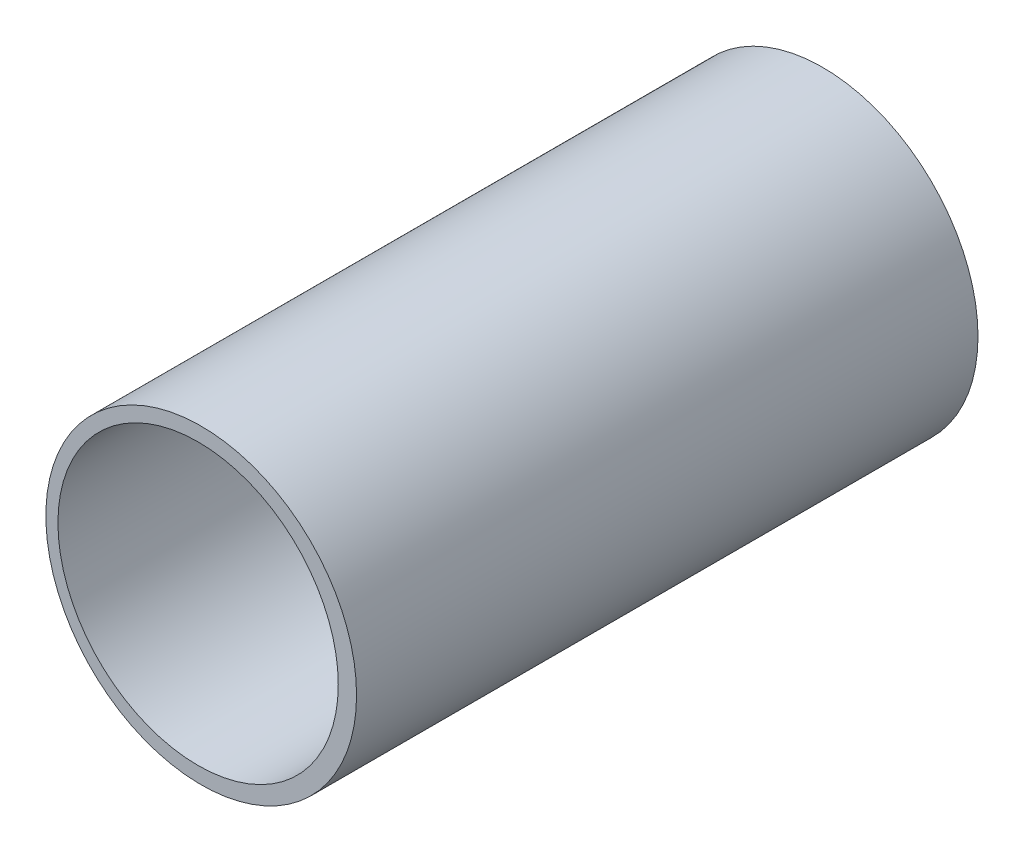
ISO-10303-21;
HEADER;
FILE_DESCRIPTION(('STEP AP214'),'2;1');
FILE_NAME('part.step','',(''),(''),'','','');
FILE_SCHEMA(('AUTOMOTIVE_DESIGN { 1 0 10303 214 1 1 1 1 }'));
ENDSEC;
DATA;
#1=APPLICATION_CONTEXT('core data for automotive mechanical design processes');
#2=APPLICATION_PROTOCOL_DEFINITION('international standard','automotive_design',2000,#1);
#3=PRODUCT_CONTEXT('',#1,'mechanical');
#4=PRODUCT('Part','Part','',(#3));
#5=PRODUCT_RELATED_PRODUCT_CATEGORY('part','',(#4));
#6=PRODUCT_DEFINITION_FORMATION('','',#4);
#7=PRODUCT_DEFINITION_CONTEXT('part definition',#1,'design');
#8=PRODUCT_DEFINITION('design','',#6,#7);
#9=PRODUCT_DEFINITION_SHAPE('','',#8);
#10=(LENGTH_UNIT() NAMED_UNIT(*) SI_UNIT(.MILLI.,.METRE.));
#11=(NAMED_UNIT(*) PLANE_ANGLE_UNIT() SI_UNIT($,.RADIAN.));
#12=(NAMED_UNIT(*) SI_UNIT($,.STERADIAN.) SOLID_ANGLE_UNIT());
#13=UNCERTAINTY_MEASURE_WITH_UNIT(LENGTH_MEASURE(1.E-05),#10,'distance_accuracy_value','');
#14=(GEOMETRIC_REPRESENTATION_CONTEXT(3) GLOBAL_UNCERTAINTY_ASSIGNED_CONTEXT((#13)) GLOBAL_UNIT_ASSIGNED_CONTEXT((#10,
#11,#12)) REPRESENTATION_CONTEXT('',''));
#15=CARTESIAN_POINT('',(0.,0.,0.));
#16=DIRECTION('',(0.,0.,1.));
#17=DIRECTION('',(1.,0.,0.));
#18=AXIS2_PLACEMENT_3D('',#15,#16,#17);
#19=CARTESIAN_POINT('',(0.,0.,304.8));
#20=DIRECTION('',(0.,0.,1.));
#21=DIRECTION('',(1.,0.,0.));
#22=AXIS2_PLACEMENT_3D('',#19,#20,#21);
#23=PLANE('',#22);
#24=CARTESIAN_POINT('',(0.,0.,304.8));
#25=DIRECTION('',(0.,0.,1.));
#26=DIRECTION('',(1.,0.,0.));
#27=AXIS2_PLACEMENT_3D('',#24,#25,#26);
#28=CIRCLE('',#27,76.2);
#29=CARTESIAN_POINT('',(76.2,0.,304.8));
#30=VERTEX_POINT('',#29);
#31=EDGE_CURVE('E10',#30,#30,#28,.T.);
#32=ORIENTED_EDGE('',*,*,#31,.T.);
#33=EDGE_LOOP('',(#32));
#34=FACE_BOUND('',#33,.T.);
#35=CARTESIAN_POINT('',(-1.524,0.,304.8));
#36=DIRECTION('',(0.,0.,1.));
#37=DIRECTION('',(1.,0.,0.));
#38=AXIS2_PLACEMENT_3D('',#35,#36,#37);
#39=CIRCLE('',#38,68.7471673188666);
#40=CARTESIAN_POINT('',(67.2231673188666,0.,304.8));
#41=VERTEX_POINT('',#40);
#42=EDGE_CURVE('E29',#41,#41,#39,.T.);
#43=ORIENTED_EDGE('',*,*,#42,.F.);
#44=EDGE_LOOP('',(#43));
#45=FACE_BOUND('',#44,.T.);
#46=ADVANCED_FACE('F15',(#34,#45),#23,.T.);
#47=CARTESIAN_POINT('',(0.,0.,0.));
#48=DIRECTION('',(0.,0.,1.));
#49=DIRECTION('',(1.,0.,0.));
#50=AXIS2_PLACEMENT_3D('',#47,#48,#49);
#51=PLANE('',#50);
#52=CARTESIAN_POINT('',(0.,0.,0.));
#53=DIRECTION('',(0.,0.,1.));
#54=DIRECTION('',(1.,0.,0.));
#55=AXIS2_PLACEMENT_3D('',#52,#53,#54);
#56=CIRCLE('',#55,76.2);
#57=CARTESIAN_POINT('',(76.2,0.,0.));
#58=VERTEX_POINT('',#57);
#59=EDGE_CURVE('E27',#58,#58,#56,.T.);
#60=ORIENTED_EDGE('',*,*,#59,.F.);
#61=EDGE_LOOP('',(#60));
#62=FACE_BOUND('',#61,.T.);
#63=CARTESIAN_POINT('',(-1.524,0.,0.));
#64=DIRECTION('',(0.,0.,1.));
#65=DIRECTION('',(1.,0.,0.));
#66=AXIS2_PLACEMENT_3D('',#63,#64,#65);
#67=CIRCLE('',#66,68.7471673188666);
#68=CARTESIAN_POINT('',(67.2231673188666,0.,0.));
#69=VERTEX_POINT('',#68);
#70=EDGE_CURVE('E19',#69,#69,#67,.T.);
#71=ORIENTED_EDGE('',*,*,#70,.T.);
#72=EDGE_LOOP('',(#71));
#73=FACE_BOUND('',#72,.T.);
#74=ADVANCED_FACE('F36',(#62,#73),#51,.F.);
#75=CARTESIAN_POINT('',(0.,0.,304.8));
#76=DIRECTION('',(0.,0.,-1.));
#77=DIRECTION('',(-1.,0.,0.));
#78=AXIS2_PLACEMENT_3D('',#75,#76,#77);
#79=CYLINDRICAL_SURFACE('',#78,76.2);
#80=ORIENTED_EDGE('',*,*,#31,.F.);
#81=EDGE_LOOP('',(#80));
#82=FACE_BOUND('',#81,.T.);
#83=ORIENTED_EDGE('',*,*,#59,.T.);
#84=EDGE_LOOP('',(#83));
#85=FACE_BOUND('',#84,.T.);
#86=ADVANCED_FACE('F34',(#82,#85),#79,.T.);
#87=CARTESIAN_POINT('',(-1.524,0.,304.8));
#88=DIRECTION('',(0.,0.,-1.));
#89=DIRECTION('',(-1.,0.,0.));
#90=AXIS2_PLACEMENT_3D('',#87,#88,#89);
#91=CYLINDRICAL_SURFACE('',#90,68.7471673188666);
#92=ORIENTED_EDGE('',*,*,#42,.T.);
#93=EDGE_LOOP('',(#92));
#94=FACE_BOUND('',#93,.T.);
#95=ORIENTED_EDGE('',*,*,#70,.F.);
#96=EDGE_LOOP('',(#95));
#97=FACE_BOUND('',#96,.T.);
#98=ADVANCED_FACE('F17',(#94,#97),#91,.F.);
#99=CLOSED_SHELL('',(#46,#74,#86,#98));
#100=MANIFOLD_SOLID_BREP('B1',#99);
#101=ADVANCED_BREP_SHAPE_REPRESENTATION('',(#18,#100),#14);
#102=SHAPE_DEFINITION_REPRESENTATION(#9,#101);
ENDSEC;
END-ISO-10303-21;
